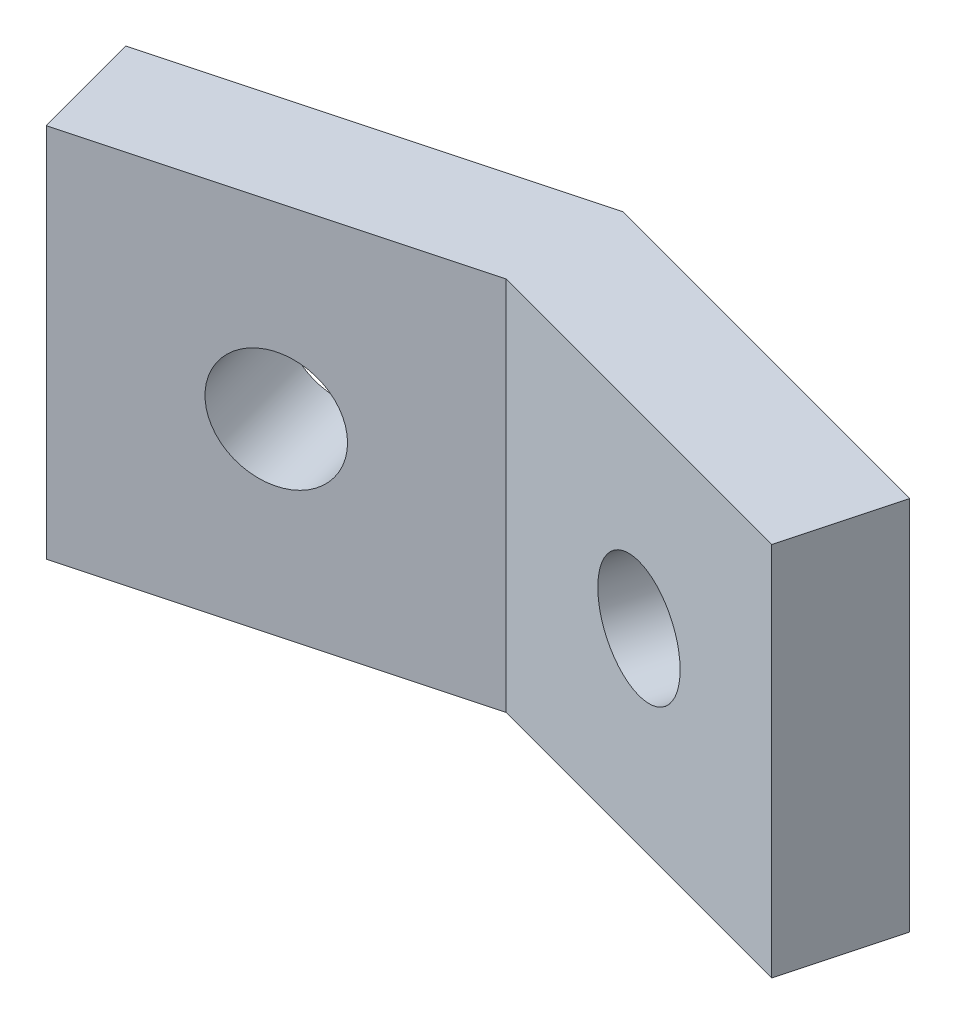
ISO-10303-21;
HEADER;
FILE_DESCRIPTION(('STEP AP214'),'2;1');
FILE_NAME('part.step','',(''),(''),'','','');
FILE_SCHEMA(('AUTOMOTIVE_DESIGN { 1 0 10303 214 1 1 1 1 }'));
ENDSEC;
DATA;
#1=APPLICATION_CONTEXT('core data for automotive mechanical design processes');
#2=APPLICATION_PROTOCOL_DEFINITION('international standard','automotive_design',2000,#1);
#3=PRODUCT_CONTEXT('',#1,'mechanical');
#4=PRODUCT('Part','Part','',(#3));
#5=PRODUCT_RELATED_PRODUCT_CATEGORY('part','',(#4));
#6=PRODUCT_DEFINITION_FORMATION('','',#4);
#7=PRODUCT_DEFINITION_CONTEXT('part definition',#1,'design');
#8=PRODUCT_DEFINITION('design','',#6,#7);
#9=PRODUCT_DEFINITION_SHAPE('','',#8);
#10=(LENGTH_UNIT() NAMED_UNIT(*) SI_UNIT(.MILLI.,.METRE.));
#11=(NAMED_UNIT(*) PLANE_ANGLE_UNIT() SI_UNIT($,.RADIAN.));
#12=(NAMED_UNIT(*) SI_UNIT($,.STERADIAN.) SOLID_ANGLE_UNIT());
#13=UNCERTAINTY_MEASURE_WITH_UNIT(LENGTH_MEASURE(1.E-05),#10,'distance_accuracy_value','');
#14=(GEOMETRIC_REPRESENTATION_CONTEXT(3) GLOBAL_UNCERTAINTY_ASSIGNED_CONTEXT((#13)) GLOBAL_UNIT_ASSIGNED_CONTEXT((#10,
#11,#12)) REPRESENTATION_CONTEXT('',''));
#15=CARTESIAN_POINT('',(0.,0.,0.));
#16=DIRECTION('',(0.,0.,1.));
#17=DIRECTION('',(1.,0.,0.));
#18=AXIS2_PLACEMENT_3D('',#15,#16,#17);
#19=CARTESIAN_POINT('',(-9.65925826289067,10.,4.14110472164038));
#20=DIRECTION('',(-0.258819045102525,0.,-0.965925826289067));
#21=DIRECTION('',(-0.965925826289067,0.,0.258819045102525));
#22=AXIS2_PLACEMENT_3D('',#19,#20,#21);
#23=PLANE('',#22);
#24=CARTESIAN_POINT('',(-4.82962913144534,5.,2.84700949612775));
#25=DIRECTION('',(0.258819045102525,0.,0.965925826289067));
#26=DIRECTION('',(0.965925826289067,0.,-0.258819045102525));
#27=AXIS2_PLACEMENT_3D('',#24,#25,#26);
#28=CIRCLE('',#27,1.55);
#29=CARTESIAN_POINT('',(-3.33244410069728,5.,2.44583997621884));
#30=VERTEX_POINT('',#29);
#31=EDGE_CURVE('E158',#30,#30,#28,.T.);
#32=ORIENTED_EDGE('',*,*,#31,.F.);
#33=EDGE_LOOP('',(#32));
#34=FACE_BOUND('',#33,.T.);
#35=DIRECTION('',(0.965925826289067,0.,-0.258819045102525));
#36=VECTOR('',#35,1.);
#37=CARTESIAN_POINT('',(-9.65925826289067,0.,4.14110472164038));
#38=LINE('',#37,#36);
#39=CARTESIAN_POINT('',(-9.65925826289067,0.,4.14110472164038));
#40=VERTEX_POINT('',#39);
#41=CARTESIAN_POINT('',(0.,0.,1.55291427061513));
#42=VERTEX_POINT('',#41);
#43=EDGE_CURVE('E130',#40,#42,#38,.T.);
#44=ORIENTED_EDGE('',*,*,#43,.T.);
#45=DIRECTION('',(0.,-1.,0.));
#46=VECTOR('',#45,1.);
#47=CARTESIAN_POINT('',(0.,10.,1.55291427061513));
#48=LINE('',#47,#46);
#49=CARTESIAN_POINT('',(0.,10.,1.55291427061513));
#50=VERTEX_POINT('',#49);
#51=EDGE_CURVE('E11',#50,#42,#48,.T.);
#52=ORIENTED_EDGE('',*,*,#51,.F.);
#53=DIRECTION('',(0.965925826289067,0.,-0.258819045102525));
#54=VECTOR('',#53,1.);
#55=CARTESIAN_POINT('',(-9.65925826289067,10.,4.14110472164038));
#56=LINE('',#55,#54);
#57=CARTESIAN_POINT('',(-9.65925826289067,10.,4.14110472164038));
#58=VERTEX_POINT('',#57);
#59=EDGE_CURVE('E147',#58,#50,#56,.T.);
#60=ORIENTED_EDGE('',*,*,#59,.F.);
#61=DIRECTION('',(0.,-1.,0.));
#62=VECTOR('',#61,1.);
#63=CARTESIAN_POINT('',(-9.65925826289067,10.,4.14110472164038));
#64=LINE('',#63,#62);
#65=EDGE_CURVE('E126',#58,#40,#64,.T.);
#66=ORIENTED_EDGE('',*,*,#65,.T.);
#67=EDGE_LOOP('',(#44,#52,#60,#66));
#68=FACE_BOUND('',#67,.T.);
#69=ADVANCED_FACE('F39',(#34,#68),#23,.F.);
#70=CARTESIAN_POINT('',(9.65925826289067,10.,4.14110472164037));
#71=DIRECTION('',(0.258819045102524,0.,-0.965925826289067));
#72=DIRECTION('',(-0.965925826289068,0.,-0.258819045102524));
#73=AXIS2_PLACEMENT_3D('',#70,#71,#72);
#74=PLANE('',#73);
#75=CARTESIAN_POINT('',(4.82962913144534,5.,2.84700949612775));
#76=DIRECTION('',(-0.258819045102524,0.,0.965925826289067));
#77=DIRECTION('',(0.965925826289067,0.,0.258819045102524));
#78=AXIS2_PLACEMENT_3D('',#75,#76,#77);
#79=CIRCLE('',#78,1.55);
#80=CARTESIAN_POINT('',(6.32681416219339,5.,3.24817901603666));
#81=VERTEX_POINT('',#80);
#82=EDGE_CURVE('E168',#81,#81,#79,.T.);
#83=ORIENTED_EDGE('',*,*,#82,.F.);
#84=EDGE_LOOP('',(#83));
#85=FACE_BOUND('',#84,.T.);
#86=DIRECTION('',(0.965925826289067,0.,0.258819045102524));
#87=VECTOR('',#86,1.);
#88=CARTESIAN_POINT('',(9.65925826289067,0.,4.14110472164037));
#89=LINE('',#88,#87);
#90=CARTESIAN_POINT('',(9.65925826289067,0.,4.14110472164037));
#91=VERTEX_POINT('',#90);
#92=EDGE_CURVE('E134',#42,#91,#89,.T.);
#93=ORIENTED_EDGE('',*,*,#92,.T.);
#94=DIRECTION('',(0.,-1.,0.));
#95=VECTOR('',#94,1.);
#96=CARTESIAN_POINT('',(9.65925826289067,10.,4.14110472164037));
#97=LINE('',#96,#95);
#98=CARTESIAN_POINT('',(9.65925826289067,10.,4.14110472164037));
#99=VERTEX_POINT('',#98);
#100=EDGE_CURVE('E49',#99,#91,#97,.T.);
#101=ORIENTED_EDGE('',*,*,#100,.F.);
#102=DIRECTION('',(0.965925826289067,0.,0.258819045102524));
#103=VECTOR('',#102,1.);
#104=CARTESIAN_POINT('',(9.65925826289067,10.,4.14110472164037));
#105=LINE('',#104,#103);
#106=EDGE_CURVE('E95',#50,#99,#105,.T.);
#107=ORIENTED_EDGE('',*,*,#106,.F.);
#108=ORIENTED_EDGE('',*,*,#51,.T.);
#109=EDGE_LOOP('',(#93,#101,#107,#108));
#110=FACE_BOUND('',#109,.T.);
#111=ADVANCED_FACE('F177',(#85,#110),#74,.F.);
#112=CARTESIAN_POINT('',(10.4357153981982,10.,1.24332724277317));
#113=DIRECTION('',(-0.965925826289067,0.,-0.258819045102526));
#114=DIRECTION('',(-0.258819045102526,0.,0.965925826289067));
#115=AXIS2_PLACEMENT_3D('',#112,#113,#114);
#116=PLANE('',#115);
#117=DIRECTION('',(0.258819045102526,0.,-0.965925826289067));
#118=VECTOR('',#117,1.);
#119=CARTESIAN_POINT('',(10.4357153981982,0.,1.24332724277317));
#120=LINE('',#119,#118);
#121=CARTESIAN_POINT('',(10.4357153981982,0.,1.24332724277317));
#122=VERTEX_POINT('',#121);
#123=EDGE_CURVE('E138',#91,#122,#120,.T.);
#124=ORIENTED_EDGE('',*,*,#123,.T.);
#125=DIRECTION('',(0.,-1.,0.));
#126=VECTOR('',#125,1.);
#127=CARTESIAN_POINT('',(10.4357153981982,10.,1.24332724277317));
#128=LINE('',#127,#126);
#129=CARTESIAN_POINT('',(10.4357153981982,10.,1.24332724277317));
#130=VERTEX_POINT('',#129);
#131=EDGE_CURVE('E119',#130,#122,#128,.T.);
#132=ORIENTED_EDGE('',*,*,#131,.F.);
#133=DIRECTION('',(0.258819045102526,0.,-0.965925826289067));
#134=VECTOR('',#133,1.);
#135=CARTESIAN_POINT('',(10.4357153981982,10.,1.24332724277317));
#136=LINE('',#135,#134);
#137=EDGE_CURVE('E108',#99,#130,#136,.T.);
#138=ORIENTED_EDGE('',*,*,#137,.F.);
#139=ORIENTED_EDGE('',*,*,#100,.T.);
#140=EDGE_LOOP('',(#124,#132,#138,#139));
#141=FACE_BOUND('',#140,.T.);
#142=ADVANCED_FACE('F180',(#141),#116,.F.);
#143=CARTESIAN_POINT('',(0.,10.,-1.55291427061513));
#144=DIRECTION('',(-0.258819045102525,0.,0.965925826289067));
#145=DIRECTION('',(0.965925826289067,0.,0.258819045102525));
#146=AXIS2_PLACEMENT_3D('',#143,#144,#145);
#147=PLANE('',#146);
#148=CARTESIAN_POINT('',(5.60608626675291,5.,-0.0507679827394516));
#149=DIRECTION('',(-0.258819045102525,0.,0.965925826289067));
#150=DIRECTION('',(0.965925826289067,0.,0.258819045102525));
#151=AXIS2_PLACEMENT_3D('',#148,#149,#150);
#152=CIRCLE('',#151,1.55);
#153=CARTESIAN_POINT('',(7.10327129750096,5.,0.350401537169462));
#154=VERTEX_POINT('',#153);
#155=EDGE_CURVE('E42',#154,#154,#152,.T.);
#156=ORIENTED_EDGE('',*,*,#155,.T.);
#157=EDGE_LOOP('',(#156));
#158=FACE_BOUND('',#157,.T.);
#159=DIRECTION('',(-0.965925826289067,0.,-0.258819045102525));
#160=VECTOR('',#159,1.);
#161=CARTESIAN_POINT('',(0.,0.,-1.55291427061513));
#162=LINE('',#161,#160);
#163=CARTESIAN_POINT('',(0.,0.,-1.55291427061513));
#164=VERTEX_POINT('',#163);
#165=EDGE_CURVE('E117',#122,#164,#162,.T.);
#166=ORIENTED_EDGE('',*,*,#165,.T.);
#167=DIRECTION('',(0.,-1.,0.));
#168=VECTOR('',#167,1.);
#169=CARTESIAN_POINT('',(0.,10.,-1.55291427061513));
#170=LINE('',#169,#168);
#171=CARTESIAN_POINT('',(0.,10.,-1.55291427061513));
#172=VERTEX_POINT('',#171);
#173=EDGE_CURVE('E114',#172,#164,#170,.T.);
#174=ORIENTED_EDGE('',*,*,#173,.F.);
#175=DIRECTION('',(-0.965925826289067,0.,-0.258819045102525));
#176=VECTOR('',#175,1.);
#177=CARTESIAN_POINT('',(0.,10.,-1.55291427061513));
#178=LINE('',#177,#176);
#179=EDGE_CURVE('E102',#130,#172,#178,.T.);
#180=ORIENTED_EDGE('',*,*,#179,.F.);
#181=ORIENTED_EDGE('',*,*,#131,.T.);
#182=EDGE_LOOP('',(#166,#174,#180,#181));
#183=FACE_BOUND('',#182,.T.);
#184=ADVANCED_FACE('F115',(#158,#183),#147,.F.);
#185=CARTESIAN_POINT('',(0.,10.,-1.55291427061513));
#186=DIRECTION('',(0.258819045102525,0.,0.965925826289067));
#187=DIRECTION('',(0.965925826289067,0.,-0.258819045102525));
#188=AXIS2_PLACEMENT_3D('',#185,#186,#187);
#189=PLANE('',#188);
#190=CARTESIAN_POINT('',(-5.60608626675291,5.,-0.0507679827394499));
#191=DIRECTION('',(0.258819045102525,0.,0.965925826289067));
#192=DIRECTION('',(0.965925826289067,0.,-0.258819045102525));
#193=AXIS2_PLACEMENT_3D('',#190,#191,#192);
#194=CIRCLE('',#193,1.55);
#195=CARTESIAN_POINT('',(-4.10890123600486,5.,-0.451937502648364));
#196=VERTEX_POINT('',#195);
#197=EDGE_CURVE('E135',#196,#196,#194,.T.);
#198=ORIENTED_EDGE('',*,*,#197,.T.);
#199=EDGE_LOOP('',(#198));
#200=FACE_BOUND('',#199,.T.);
#201=DIRECTION('',(-0.965925826289067,0.,0.258819045102525));
#202=VECTOR('',#201,1.);
#203=CARTESIAN_POINT('',(0.,0.,-1.55291427061513));
#204=LINE('',#203,#202);
#205=CARTESIAN_POINT('',(-10.4357153981982,0.,1.24332724277318));
#206=VERTEX_POINT('',#205);
#207=EDGE_CURVE('E81',#164,#206,#204,.T.);
#208=ORIENTED_EDGE('',*,*,#207,.T.);
#209=DIRECTION('',(0.,-1.,0.));
#210=VECTOR('',#209,1.);
#211=CARTESIAN_POINT('',(-10.4357153981982,10.,1.24332724277318));
#212=LINE('',#211,#210);
#213=CARTESIAN_POINT('',(-10.4357153981982,10.,1.24332724277318));
#214=VERTEX_POINT('',#213);
#215=EDGE_CURVE('E120',#214,#206,#212,.T.);
#216=ORIENTED_EDGE('',*,*,#215,.F.);
#217=DIRECTION('',(-0.965925826289067,0.,0.258819045102525));
#218=VECTOR('',#217,1.);
#219=CARTESIAN_POINT('',(0.,10.,-1.55291427061513));
#220=LINE('',#219,#218);
#221=EDGE_CURVE('E106',#172,#214,#220,.T.);
#222=ORIENTED_EDGE('',*,*,#221,.F.);
#223=ORIENTED_EDGE('',*,*,#173,.T.);
#224=EDGE_LOOP('',(#208,#216,#222,#223));
#225=FACE_BOUND('',#224,.T.);
#226=ADVANCED_FACE('F122',(#200,#225),#189,.F.);
#227=CARTESIAN_POINT('',(-10.4357153981982,10.,1.24332724277318));
#228=DIRECTION('',(0.965925826289067,0.,-0.258819045102526));
#229=DIRECTION('',(-0.258819045102526,0.,-0.965925826289067));
#230=AXIS2_PLACEMENT_3D('',#227,#228,#229);
#231=PLANE('',#230);
#232=DIRECTION('',(0.258819045102526,0.,0.965925826289067));
#233=VECTOR('',#232,1.);
#234=CARTESIAN_POINT('',(-10.4357153981982,0.,1.24332724277318));
#235=LINE('',#234,#233);
#236=EDGE_CURVE('E87',#206,#40,#235,.T.);
#237=ORIENTED_EDGE('',*,*,#236,.T.);
#238=ORIENTED_EDGE('',*,*,#65,.F.);
#239=DIRECTION('',(0.258819045102526,0.,0.965925826289067));
#240=VECTOR('',#239,1.);
#241=CARTESIAN_POINT('',(-10.4357153981982,10.,1.24332724277318));
#242=LINE('',#241,#240);
#243=EDGE_CURVE('E58',#214,#58,#242,.T.);
#244=ORIENTED_EDGE('',*,*,#243,.F.);
#245=ORIENTED_EDGE('',*,*,#215,.T.);
#246=EDGE_LOOP('',(#237,#238,#244,#245));
#247=FACE_BOUND('',#246,.T.);
#248=ADVANCED_FACE('F185',(#247),#231,.F.);
#249=CARTESIAN_POINT('',(0.,10.,0.));
#250=DIRECTION('',(0.,-1.,0.));
#251=DIRECTION('',(0.,0.,-1.));
#252=AXIS2_PLACEMENT_3D('',#249,#250,#251);
#253=PLANE('',#252);
#254=ORIENTED_EDGE('',*,*,#59,.T.);
#255=ORIENTED_EDGE('',*,*,#106,.T.);
#256=ORIENTED_EDGE('',*,*,#137,.T.);
#257=ORIENTED_EDGE('',*,*,#179,.T.);
#258=ORIENTED_EDGE('',*,*,#221,.T.);
#259=ORIENTED_EDGE('',*,*,#243,.T.);
#260=EDGE_LOOP('',(#254,#255,#256,#257,#258,#259));
#261=FACE_BOUND('',#260,.T.);
#262=ADVANCED_FACE('F104',(#261),#253,.F.);
#263=CARTESIAN_POINT('',(0.,0.,0.));
#264=DIRECTION('',(0.,-1.,0.));
#265=DIRECTION('',(0.,0.,-1.));
#266=AXIS2_PLACEMENT_3D('',#263,#264,#265);
#267=PLANE('',#266);
#268=ORIENTED_EDGE('',*,*,#43,.F.);
#269=ORIENTED_EDGE('',*,*,#236,.F.);
#270=ORIENTED_EDGE('',*,*,#207,.F.);
#271=ORIENTED_EDGE('',*,*,#165,.F.);
#272=ORIENTED_EDGE('',*,*,#123,.F.);
#273=ORIENTED_EDGE('',*,*,#92,.F.);
#274=EDGE_LOOP('',(#268,#269,#270,#271,#272,#273));
#275=FACE_BOUND('',#274,.T.);
#276=ADVANCED_FACE('F183',(#275),#267,.T.);
#277=CARTESIAN_POINT('',(-7.41781958247058,5.,-6.81224876676292));
#278=DIRECTION('',(0.258819045102525,0.,0.965925826289067));
#279=DIRECTION('',(0.965925826289067,0.,-0.258819045102525));
#280=AXIS2_PLACEMENT_3D('',#277,#278,#279);
#281=CYLINDRICAL_SURFACE('',#280,1.55);
#282=ORIENTED_EDGE('',*,*,#31,.T.);
#283=EDGE_LOOP('',(#282));
#284=FACE_BOUND('',#283,.T.);
#285=ORIENTED_EDGE('',*,*,#197,.F.);
#286=EDGE_LOOP('',(#285));
#287=FACE_BOUND('',#286,.T.);
#288=ADVANCED_FACE('F215',(#284,#287),#281,.F.);
#289=CARTESIAN_POINT('',(7.41781958247058,5.,-6.81224876676292));
#290=DIRECTION('',(-0.258819045102524,0.,0.965925826289067));
#291=DIRECTION('',(0.965925826289068,0.,0.258819045102524));
#292=AXIS2_PLACEMENT_3D('',#289,#290,#291);
#293=CYLINDRICAL_SURFACE('',#292,1.55);
#294=ORIENTED_EDGE('',*,*,#82,.T.);
#295=EDGE_LOOP('',(#294));
#296=FACE_BOUND('',#295,.T.);
#297=ORIENTED_EDGE('',*,*,#155,.F.);
#298=EDGE_LOOP('',(#297));
#299=FACE_BOUND('',#298,.T.);
#300=ADVANCED_FACE('F213',(#296,#299),#293,.F.);
#301=CLOSED_SHELL('',(#69,#111,#142,#184,#226,#248,#262,#276,#288,#300));
#302=MANIFOLD_SOLID_BREP('B2',#301);
#303=ADVANCED_BREP_SHAPE_REPRESENTATION('',(#18,#302),#14);
#304=SHAPE_DEFINITION_REPRESENTATION(#9,#303);
ENDSEC;
END-ISO-10303-21;
